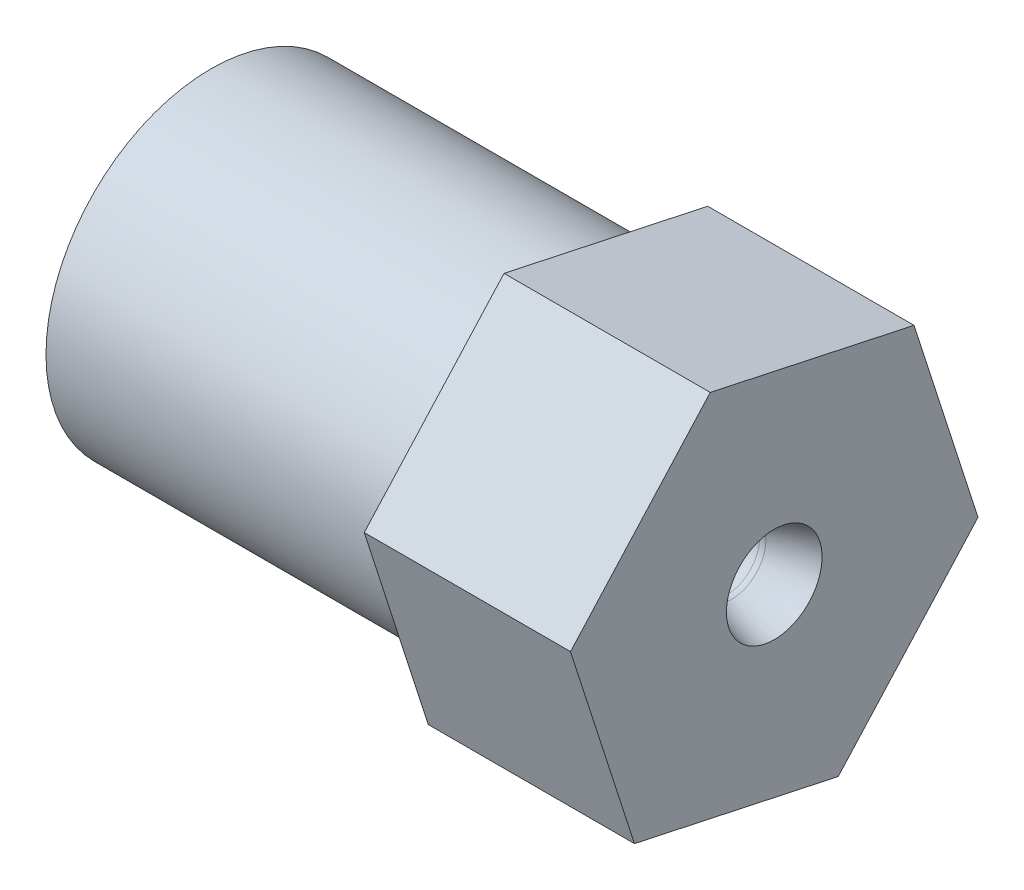
ISO-10303-21;
HEADER;
FILE_DESCRIPTION(('STEP AP214'),'2;1');
FILE_NAME('part.step','',(''),(''),'','','');
FILE_SCHEMA(('AUTOMOTIVE_DESIGN { 1 0 10303 214 1 1 1 1 }'));
ENDSEC;
DATA;
#1=APPLICATION_CONTEXT('core data for automotive mechanical design processes');
#2=APPLICATION_PROTOCOL_DEFINITION('international standard','automotive_design',2000,#1);
#3=PRODUCT_CONTEXT('',#1,'mechanical');
#4=PRODUCT('Part','Part','',(#3));
#5=PRODUCT_RELATED_PRODUCT_CATEGORY('part','',(#4));
#6=PRODUCT_DEFINITION_FORMATION('','',#4);
#7=PRODUCT_DEFINITION_CONTEXT('part definition',#1,'design');
#8=PRODUCT_DEFINITION('design','',#6,#7);
#9=PRODUCT_DEFINITION_SHAPE('','',#8);
#10=(LENGTH_UNIT() NAMED_UNIT(*) SI_UNIT(.MILLI.,.METRE.));
#11=(NAMED_UNIT(*) PLANE_ANGLE_UNIT() SI_UNIT($,.RADIAN.));
#12=(NAMED_UNIT(*) SI_UNIT($,.STERADIAN.) SOLID_ANGLE_UNIT());
#13=UNCERTAINTY_MEASURE_WITH_UNIT(LENGTH_MEASURE(1.E-05),#10,'distance_accuracy_value','');
#14=(GEOMETRIC_REPRESENTATION_CONTEXT(3) GLOBAL_UNCERTAINTY_ASSIGNED_CONTEXT((#13)) GLOBAL_UNIT_ASSIGNED_CONTEXT((#10,
#11,#12)) REPRESENTATION_CONTEXT('',''));
#15=CARTESIAN_POINT('',(0.,0.,0.));
#16=DIRECTION('',(0.,0.,1.));
#17=DIRECTION('',(1.,0.,0.));
#18=AXIS2_PLACEMENT_3D('',#15,#16,#17);
#19=CARTESIAN_POINT('',(0.,0.,0.));
#20=DIRECTION('',(-1.,0.,0.));
#21=DIRECTION('',(0.,0.,1.));
#22=AXIS2_PLACEMENT_3D('',#19,#20,#21);
#23=CYLINDRICAL_SURFACE('',#22,10.16);
#24=CARTESIAN_POINT('',(-10.4014737867327,0.,0.));
#25=DIRECTION('',(1.,0.,0.));
#26=DIRECTION('',(0.,0.,-1.));
#27=AXIS2_PLACEMENT_3D('',#24,#25,#26);
#28=CIRCLE('',#27,10.16);
#29=CARTESIAN_POINT('',(-10.4014737867327,0.,-10.16));
#30=VERTEX_POINT('',#29);
#31=EDGE_CURVE('E11',#30,#30,#28,.F.);
#32=ORIENTED_EDGE('',*,*,#31,.T.);
#33=EDGE_LOOP('',(#32));
#34=FACE_BOUND('',#33,.T.);
#35=CARTESIAN_POINT('',(-31.75,0.,0.));
#36=DIRECTION('',(-1.,0.,0.));
#37=DIRECTION('',(0.,0.,1.));
#38=AXIS2_PLACEMENT_3D('',#35,#36,#37);
#39=CIRCLE('',#38,10.16);
#40=CARTESIAN_POINT('',(-31.75,0.,10.16));
#41=VERTEX_POINT('',#40);
#42=EDGE_CURVE('E227',#41,#41,#39,.T.);
#43=ORIENTED_EDGE('',*,*,#42,.F.);
#44=EDGE_LOOP('',(#43));
#45=FACE_BOUND('',#44,.T.);
#46=ADVANCED_FACE('F39',(#34,#45),#23,.T.);
#47=CARTESIAN_POINT('',(0.,0.,0.));
#48=DIRECTION('',(-1.,0.,0.));
#49=DIRECTION('',(0.,0.,1.));
#50=AXIS2_PLACEMENT_3D('',#47,#48,#49);
#51=TOROIDAL_SURFACE('',#50,5.08,3.048);
#52=CARTESIAN_POINT('',(0.,0.,0.));
#53=DIRECTION('',(-1.,0.,0.));
#54=DIRECTION('',(0.,0.,1.));
#55=AXIS2_PLACEMENT_3D('',#52,#53,#54);
#56=CIRCLE('',#55,2.03200000000473);
#57=CARTESIAN_POINT('',(0.,0.,2.03200000000473));
#58=VERTEX_POINT('',#57);
#59=EDGE_CURVE('E179',#58,#58,#56,.T.);
#60=ORIENTED_EDGE('',*,*,#59,.F.);
#61=EDGE_LOOP('',(#60));
#62=FACE_BOUND('',#61,.T.);
#63=CARTESIAN_POINT('',(-2.15526146905657,0.,0.));
#64=DIRECTION('',(-1.,0.,0.));
#65=DIRECTION('',(0.,0.,1.));
#66=AXIS2_PLACEMENT_3D('',#63,#64,#65);
#67=CIRCLE('',#66,2.92473853094338);
#68=CARTESIAN_POINT('',(-2.15526146905657,0.,2.92473853094338));
#69=VERTEX_POINT('',#68);
#70=EDGE_CURVE('E144',#69,#69,#67,.T.);
#71=ORIENTED_EDGE('',*,*,#70,.T.);
#72=EDGE_LOOP('',(#71));
#73=FACE_BOUND('',#72,.T.);
#74=ADVANCED_FACE('F168',(#62,#73),#51,.T.);
#75=CARTESIAN_POINT('',(0.,0.,0.));
#76=DIRECTION('',(-1.,0.,0.));
#77=DIRECTION('',(0.,0.,1.));
#78=AXIS2_PLACEMENT_3D('',#75,#76,#77);
#79=TOROIDAL_SURFACE('',#78,2.8448,0.81279999999527);
#80=CARTESIAN_POINT('',(0.317586257187585,0.,0.));
#81=DIRECTION('',(-1.,0.,0.));
#82=DIRECTION('',(0.,0.,1.));
#83=AXIS2_PLACEMENT_3D('',#80,#81,#82);
#84=CIRCLE('',#83,2.09661365337699);
#85=CARTESIAN_POINT('',(0.317586257187585,0.,2.09661365337699));
#86=VERTEX_POINT('',#85);
#87=EDGE_CURVE('E233',#86,#86,#84,.T.);
#88=ORIENTED_EDGE('',*,*,#87,.F.);
#89=EDGE_LOOP('',(#88));
#90=FACE_BOUND('',#89,.T.);
#91=ORIENTED_EDGE('',*,*,#59,.T.);
#92=EDGE_LOOP('',(#91));
#93=FACE_BOUND('',#92,.T.);
#94=ADVANCED_FACE('F164',(#90,#93),#79,.T.);
#95=CARTESIAN_POINT('',(385600.415947016,-922680.749909568,0.));
#96=CARTESIAN_POINT('',(-390730.810905124,920506.950065199,0.));
#97=CARTESIAN_POINT('',(395862.476208277,-918324.76376621,0.));
#98=B_SPLINE_CURVE_WITH_KNOTS('',2,(#95,#96,#97),.UNSPECIFIED.,.F.,.F.,(3,3),(0.,1.),.UNSPECIFIED.);
#99=CARTESIAN_POINT('',(0.,0.,0.));
#100=DIRECTION('',(-1.,0.,0.));
#101=AXIS1_PLACEMENT('',#99,#100);
#102=SURFACE_OF_REVOLUTION('',#98,#101);
#103=CARTESIAN_POINT('',(2.93352621329061,0.,0.));
#104=DIRECTION('',(-1.,0.,0.));
#105=DIRECTION('',(0.,0.,1.));
#106=AXIS2_PLACEMENT_3D('',#103,#104,#105);
#107=CIRCLE('',#106,2.94464775482569);
#108=CARTESIAN_POINT('',(2.93352621329061,0.,2.94464775482569));
#109=VERTEX_POINT('',#108);
#110=EDGE_CURVE('E230',#109,#109,#107,.T.);
#111=ORIENTED_EDGE('',*,*,#110,.F.);
#112=EDGE_LOOP('',(#111));
#113=FACE_BOUND('',#112,.T.);
#114=ORIENTED_EDGE('',*,*,#87,.T.);
#115=EDGE_LOOP('',(#114));
#116=FACE_BOUND('',#115,.T.);
#117=ADVANCED_FACE('F159',(#113,#116),#102,.T.);
#118=CARTESIAN_POINT('',(2.93352621326732,10.16,0.));
#119=DIRECTION('',(-1.,0.,0.));
#120=DIRECTION('',(0.,0.,1.));
#121=AXIS2_PLACEMENT_3D('',#118,#119,#120);
#122=PLANE('',#121);
#123=ORIENTED_EDGE('',*,*,#110,.T.);
#124=EDGE_LOOP('',(#123));
#125=FACE_BOUND('',#124,.T.);
#126=DIRECTION('',(0.,-0.951681663898051,-0.307086324345838));
#127=VECTOR('',#126,1.);
#128=CARTESIAN_POINT('',(2.93352621326732,-3.41249677929311,10.575562490067));
#129=LINE('',#128,#127);
#130=CARTESIAN_POINT('',(2.93352621326732,2.69330707117879,12.5457684242006));
#131=VERTEX_POINT('',#130);
#132=CARTESIAN_POINT('',(2.93352621326732,-9.51830062976508,8.60535655593342));
#133=VERTEX_POINT('',#132);
#134=EDGE_CURVE('E127',#131,#133,#129,.T.);
#135=ORIENTED_EDGE('',*,*,#134,.T.);
#136=DIRECTION('',(0.,-0.209896273910743,-0.977723659424475));
#137=VECTOR('',#136,1.);
#138=CARTESIAN_POINT('',(2.93352621326732,-10.8649541653545,2.33247234383313));
#139=LINE('',#138,#137);
#140=CARTESIAN_POINT('',(2.93352621326732,-12.2116077009439,-3.94041186826731));
#141=VERTEX_POINT('',#140);
#142=EDGE_CURVE('E130',#133,#141,#139,.T.);
#143=ORIENTED_EDGE('',*,*,#142,.T.);
#144=DIRECTION('',(0.,0.741785389987309,-0.670637335078637));
#145=VECTOR('',#144,1.);
#146=CARTESIAN_POINT('',(2.93352621326732,-7.45245738606141,-8.24309014623402));
#147=LINE('',#146,#145);
#148=CARTESIAN_POINT('',(2.93352621326732,-2.69330707117886,-12.5457684242008));
#149=VERTEX_POINT('',#148);
#150=EDGE_CURVE('E133',#141,#149,#147,.T.);
#151=ORIENTED_EDGE('',*,*,#150,.T.);
#152=DIRECTION('',(0.,0.951681663898051,0.307086324345838));
#153=VECTOR('',#152,1.);
#154=CARTESIAN_POINT('',(2.93352621326732,3.41249677929314,-10.5755624900671));
#155=LINE('',#154,#153);
#156=CARTESIAN_POINT('',(2.93352621326732,9.51830062976503,-8.60535655593354));
#157=VERTEX_POINT('',#156);
#158=EDGE_CURVE('E136',#149,#157,#155,.T.);
#159=ORIENTED_EDGE('',*,*,#158,.T.);
#160=DIRECTION('',(0.,0.209896273910741,0.977723659424475));
#161=VECTOR('',#160,1.);
#162=CARTESIAN_POINT('',(2.93352621326732,10.8649541653544,-2.3324723438331));
#163=LINE('',#162,#161);
#164=CARTESIAN_POINT('',(2.93352621326732,12.2116077009438,3.94041186826717));
#165=VERTEX_POINT('',#164);
#166=EDGE_CURVE('E104',#157,#165,#163,.T.);
#167=ORIENTED_EDGE('',*,*,#166,.T.);
#168=DIRECTION('',(0.,-0.741785389987308,0.670637335078638));
#169=VECTOR('',#168,1.);
#170=CARTESIAN_POINT('',(2.93352621326732,7.45245738606132,8.2430901462339));
#171=LINE('',#170,#169);
#172=EDGE_CURVE('E139',#165,#131,#171,.T.);
#173=ORIENTED_EDGE('',*,*,#172,.T.);
#174=EDGE_LOOP('',(#135,#143,#151,#159,#167,#173));
#175=FACE_BOUND('',#174,.T.);
#176=ADVANCED_FACE('F163',(#125,#175),#122,.F.);
#177=CARTESIAN_POINT('',(-31.75,10.16,0.));
#178=DIRECTION('',(1.,0.,0.));
#179=DIRECTION('',(0.,0.,-1.));
#180=AXIS2_PLACEMENT_3D('',#177,#178,#179);
#181=PLANE('',#180);
#182=CARTESIAN_POINT('',(-31.75,0.,0.));
#183=DIRECTION('',(-1.,0.,0.));
#184=DIRECTION('',(0.,0.,1.));
#185=AXIS2_PLACEMENT_3D('',#182,#183,#184);
#186=CIRCLE('',#185,8.6614);
#187=CARTESIAN_POINT('',(-31.75,0.,8.6614));
#188=VERTEX_POINT('',#187);
#189=EDGE_CURVE('E224',#188,#188,#186,.T.);
#190=ORIENTED_EDGE('',*,*,#189,.F.);
#191=EDGE_LOOP('',(#190));
#192=FACE_BOUND('',#191,.T.);
#193=ORIENTED_EDGE('',*,*,#42,.T.);
#194=EDGE_LOOP('',(#193));
#195=FACE_BOUND('',#194,.T.);
#196=ADVANCED_FACE('F251',(#192,#195),#181,.F.);
#197=CARTESIAN_POINT('',(-31.115,0.,0.));
#198=DIRECTION('',(-1.,0.,0.));
#199=DIRECTION('',(0.,0.,1.));
#200=AXIS2_PLACEMENT_3D('',#197,#198,#199);
#201=TOROIDAL_SURFACE('',#200,8.6614,0.635);
#202=CARTESIAN_POINT('',(-31.115,0.,0.));
#203=DIRECTION('',(-1.,0.,0.));
#204=DIRECTION('',(0.,0.,1.));
#205=AXIS2_PLACEMENT_3D('',#202,#203,#204);
#206=CIRCLE('',#205,8.02639999999999);
#207=CARTESIAN_POINT('',(-31.115,0.,8.02639999999999));
#208=VERTEX_POINT('',#207);
#209=EDGE_CURVE('E221',#208,#208,#206,.T.);
#210=ORIENTED_EDGE('',*,*,#209,.F.);
#211=EDGE_LOOP('',(#210));
#212=FACE_BOUND('',#211,.T.);
#213=ORIENTED_EDGE('',*,*,#189,.T.);
#214=EDGE_LOOP('',(#213));
#215=FACE_BOUND('',#214,.T.);
#216=ADVANCED_FACE('F253',(#212,#215),#201,.T.);
#217=CARTESIAN_POINT('',(0.,0.,0.));
#218=DIRECTION('',(-1.,0.,0.));
#219=DIRECTION('',(0.,0.,1.));
#220=AXIS2_PLACEMENT_3D('',#217,#218,#219);
#221=CYLINDRICAL_SURFACE('',#220,8.02639999999999);
#222=CARTESIAN_POINT('',(-25.019,0.,0.));
#223=DIRECTION('',(-1.,0.,0.));
#224=DIRECTION('',(0.,0.,1.));
#225=AXIS2_PLACEMENT_3D('',#222,#223,#224);
#226=CIRCLE('',#225,8.02639999999999);
#227=CARTESIAN_POINT('',(-25.019,0.,8.02639999999999));
#228=VERTEX_POINT('',#227);
#229=EDGE_CURVE('E218',#228,#228,#226,.T.);
#230=ORIENTED_EDGE('',*,*,#229,.F.);
#231=EDGE_LOOP('',(#230));
#232=FACE_BOUND('',#231,.T.);
#233=ORIENTED_EDGE('',*,*,#209,.T.);
#234=EDGE_LOOP('',(#233));
#235=FACE_BOUND('',#234,.T.);
#236=ADVANCED_FACE('F260',(#232,#235),#221,.F.);
#237=CARTESIAN_POINT('',(-25.019,0.,0.));
#238=DIRECTION('',(-1.,0.,0.));
#239=DIRECTION('',(0.,0.,1.));
#240=AXIS2_PLACEMENT_3D('',#237,#238,#239);
#241=TOROIDAL_SURFACE('',#240,7.89939999999999,0.127);
#242=CARTESIAN_POINT('',(-24.892,0.,0.));
#243=DIRECTION('',(-1.,0.,0.));
#244=DIRECTION('',(0.,0.,1.));
#245=AXIS2_PLACEMENT_3D('',#242,#243,#244);
#246=CIRCLE('',#245,7.89939999999999);
#247=CARTESIAN_POINT('',(-24.892,0.,7.89939999999999));
#248=VERTEX_POINT('',#247);
#249=EDGE_CURVE('E215',#248,#248,#246,.T.);
#250=ORIENTED_EDGE('',*,*,#249,.F.);
#251=EDGE_LOOP('',(#250));
#252=FACE_BOUND('',#251,.T.);
#253=ORIENTED_EDGE('',*,*,#229,.T.);
#254=EDGE_LOOP('',(#253));
#255=FACE_BOUND('',#254,.T.);
#256=ADVANCED_FACE('F268',(#252,#255),#241,.F.);
#257=CARTESIAN_POINT('',(-24.892,6.9469,0.));
#258=DIRECTION('',(1.,0.,0.));
#259=DIRECTION('',(0.,0.,-1.));
#260=AXIS2_PLACEMENT_3D('',#257,#258,#259);
#261=PLANE('',#260);
#262=CARTESIAN_POINT('',(-24.892,0.,0.));
#263=DIRECTION('',(-1.,0.,0.));
#264=DIRECTION('',(0.,0.,1.));
#265=AXIS2_PLACEMENT_3D('',#262,#263,#264);
#266=CIRCLE('',#265,6.9469);
#267=CARTESIAN_POINT('',(-24.892,0.,6.9469));
#268=VERTEX_POINT('',#267);
#269=EDGE_CURVE('E212',#268,#268,#266,.T.);
#270=ORIENTED_EDGE('',*,*,#269,.F.);
#271=EDGE_LOOP('',(#270));
#272=FACE_BOUND('',#271,.T.);
#273=ORIENTED_EDGE('',*,*,#249,.T.);
#274=EDGE_LOOP('',(#273));
#275=FACE_BOUND('',#274,.T.);
#276=ADVANCED_FACE('F272',(#272,#275),#261,.F.);
#277=CARTESIAN_POINT('',(0.,0.,0.));
#278=DIRECTION('',(-1.,0.,0.));
#279=DIRECTION('',(0.,0.,1.));
#280=AXIS2_PLACEMENT_3D('',#277,#278,#279);
#281=CYLINDRICAL_SURFACE('',#280,6.9469);
#282=CARTESIAN_POINT('',(-20.066,0.,0.));
#283=DIRECTION('',(-1.,0.,0.));
#284=DIRECTION('',(0.,0.,1.));
#285=AXIS2_PLACEMENT_3D('',#282,#283,#284);
#286=CIRCLE('',#285,6.9469);
#287=CARTESIAN_POINT('',(-20.066,0.,6.9469));
#288=VERTEX_POINT('',#287);
#289=EDGE_CURVE('E209',#288,#288,#286,.T.);
#290=ORIENTED_EDGE('',*,*,#289,.F.);
#291=EDGE_LOOP('',(#290));
#292=FACE_BOUND('',#291,.T.);
#293=ORIENTED_EDGE('',*,*,#269,.T.);
#294=EDGE_LOOP('',(#293));
#295=FACE_BOUND('',#294,.T.);
#296=ADVANCED_FACE('F276',(#292,#295),#281,.F.);
#297=CARTESIAN_POINT('',(-20.066,0.,0.));
#298=DIRECTION('',(-1.,0.,0.));
#299=DIRECTION('',(0.,0.,1.));
#300=AXIS2_PLACEMENT_3D('',#297,#298,#299);
#301=TOROIDAL_SURFACE('',#300,6.8199,0.127);
#302=CARTESIAN_POINT('',(-19.939,0.,0.));
#303=DIRECTION('',(-1.,0.,0.));
#304=DIRECTION('',(0.,0.,1.));
#305=AXIS2_PLACEMENT_3D('',#302,#303,#304);
#306=CIRCLE('',#305,6.8199);
#307=CARTESIAN_POINT('',(-19.939,0.,6.8199));
#308=VERTEX_POINT('',#307);
#309=EDGE_CURVE('E206',#308,#308,#306,.T.);
#310=ORIENTED_EDGE('',*,*,#309,.F.);
#311=EDGE_LOOP('',(#310));
#312=FACE_BOUND('',#311,.T.);
#313=ORIENTED_EDGE('',*,*,#289,.T.);
#314=EDGE_LOOP('',(#313));
#315=FACE_BOUND('',#314,.T.);
#316=ADVANCED_FACE('F280',(#312,#315),#301,.F.);
#317=CARTESIAN_POINT('',(-19.939,5.46100000000001,0.));
#318=DIRECTION('',(1.,0.,0.));
#319=DIRECTION('',(0.,0.,-1.));
#320=AXIS2_PLACEMENT_3D('',#317,#318,#319);
#321=PLANE('',#320);
#322=CARTESIAN_POINT('',(-19.939,0.,0.));
#323=DIRECTION('',(-1.,0.,0.));
#324=DIRECTION('',(0.,0.,1.));
#325=AXIS2_PLACEMENT_3D('',#322,#323,#324);
#326=CIRCLE('',#325,5.46100000000001);
#327=CARTESIAN_POINT('',(-19.939,0.,5.46100000000001));
#328=VERTEX_POINT('',#327);
#329=EDGE_CURVE('E203',#328,#328,#326,.T.);
#330=ORIENTED_EDGE('',*,*,#329,.F.);
#331=EDGE_LOOP('',(#330));
#332=FACE_BOUND('',#331,.T.);
#333=ORIENTED_EDGE('',*,*,#309,.T.);
#334=EDGE_LOOP('',(#333));
#335=FACE_BOUND('',#334,.T.);
#336=ADVANCED_FACE('F284',(#332,#335),#321,.F.);
#337=CARTESIAN_POINT('',(-19.304,0.,0.));
#338=DIRECTION('',(-1.,0.,0.));
#339=DIRECTION('',(0.,0.,1.));
#340=AXIS2_PLACEMENT_3D('',#337,#338,#339);
#341=TOROIDAL_SURFACE('',#340,5.461,0.635);
#342=CARTESIAN_POINT('',(-19.304,0.,0.));
#343=DIRECTION('',(-1.,0.,0.));
#344=DIRECTION('',(0.,0.,1.));
#345=AXIS2_PLACEMENT_3D('',#342,#343,#344);
#346=CIRCLE('',#345,4.826);
#347=CARTESIAN_POINT('',(-19.304,0.,4.826));
#348=VERTEX_POINT('',#347);
#349=EDGE_CURVE('E200',#348,#348,#346,.T.);
#350=ORIENTED_EDGE('',*,*,#349,.F.);
#351=EDGE_LOOP('',(#350));
#352=FACE_BOUND('',#351,.T.);
#353=ORIENTED_EDGE('',*,*,#329,.T.);
#354=EDGE_LOOP('',(#353));
#355=FACE_BOUND('',#354,.T.);
#356=ADVANCED_FACE('F288',(#352,#355),#341,.T.);
#357=CARTESIAN_POINT('',(0.,0.,0.));
#358=DIRECTION('',(-1.,0.,0.));
#359=DIRECTION('',(0.,0.,1.));
#360=AXIS2_PLACEMENT_3D('',#357,#358,#359);
#361=CYLINDRICAL_SURFACE('',#360,4.826);
#362=CARTESIAN_POINT('',(-13.589,0.,0.));
#363=DIRECTION('',(-1.,0.,0.));
#364=DIRECTION('',(0.,0.,1.));
#365=AXIS2_PLACEMENT_3D('',#362,#363,#364);
#366=CIRCLE('',#365,4.826);
#367=CARTESIAN_POINT('',(-13.589,0.,4.826));
#368=VERTEX_POINT('',#367);
#369=EDGE_CURVE('E197',#368,#368,#366,.T.);
#370=ORIENTED_EDGE('',*,*,#369,.F.);
#371=EDGE_LOOP('',(#370));
#372=FACE_BOUND('',#371,.T.);
#373=ORIENTED_EDGE('',*,*,#349,.T.);
#374=EDGE_LOOP('',(#373));
#375=FACE_BOUND('',#374,.T.);
#376=ADVANCED_FACE('F292',(#372,#375),#361,.F.);
#377=CARTESIAN_POINT('',(-13.589,0.,0.));
#378=DIRECTION('',(-1.,0.,0.));
#379=DIRECTION('',(0.,0.,1.));
#380=AXIS2_PLACEMENT_3D('',#377,#378,#379);
#381=TOROIDAL_SURFACE('',#380,4.699,0.127);
#382=CARTESIAN_POINT('',(-13.462,0.,0.));
#383=DIRECTION('',(-1.,0.,0.));
#384=DIRECTION('',(0.,0.,1.));
#385=AXIS2_PLACEMENT_3D('',#382,#383,#384);
#386=CIRCLE('',#385,4.699);
#387=CARTESIAN_POINT('',(-13.462,0.,4.699));
#388=VERTEX_POINT('',#387);
#389=EDGE_CURVE('E194',#388,#388,#386,.T.);
#390=ORIENTED_EDGE('',*,*,#389,.F.);
#391=EDGE_LOOP('',(#390));
#392=FACE_BOUND('',#391,.T.);
#393=ORIENTED_EDGE('',*,*,#369,.T.);
#394=EDGE_LOOP('',(#393));
#395=FACE_BOUND('',#394,.T.);
#396=ADVANCED_FACE('F296',(#392,#395),#381,.F.);
#397=CARTESIAN_POINT('',(-13.462,4.445,0.));
#398=DIRECTION('',(1.,0.,0.));
#399=DIRECTION('',(0.,0.,-1.));
#400=AXIS2_PLACEMENT_3D('',#397,#398,#399);
#401=PLANE('',#400);
#402=CARTESIAN_POINT('',(-13.462,0.,0.));
#403=DIRECTION('',(-1.,0.,0.));
#404=DIRECTION('',(0.,0.,1.));
#405=AXIS2_PLACEMENT_3D('',#402,#403,#404);
#406=CIRCLE('',#405,4.445);
#407=CARTESIAN_POINT('',(-13.462,0.,4.445));
#408=VERTEX_POINT('',#407);
#409=EDGE_CURVE('E189',#408,#408,#406,.T.);
#410=ORIENTED_EDGE('',*,*,#409,.F.);
#411=EDGE_LOOP('',(#410));
#412=FACE_BOUND('',#411,.T.);
#413=ORIENTED_EDGE('',*,*,#389,.T.);
#414=EDGE_LOOP('',(#413));
#415=FACE_BOUND('',#414,.T.);
#416=ADVANCED_FACE('F300',(#412,#415),#401,.F.);
#417=CARTESIAN_POINT('',(0.,0.,0.));
#418=DIRECTION('',(-1.,0.,0.));
#419=DIRECTION('',(0.,0.,1.));
#420=AXIS2_PLACEMENT_3D('',#417,#418,#419);
#421=CYLINDRICAL_SURFACE('',#420,4.445);
#422=CARTESIAN_POINT('',(-4.99065099864778,0.,0.));
#423=DIRECTION('',(-1.,0.,0.));
#424=DIRECTION('',(0.,0.,1.));
#425=AXIS2_PLACEMENT_3D('',#422,#423,#424);
#426=CIRCLE('',#425,4.445);
#427=CARTESIAN_POINT('',(-4.99065099864778,0.,4.445));
#428=VERTEX_POINT('',#427);
#429=EDGE_CURVE('E185',#428,#428,#426,.T.);
#430=ORIENTED_EDGE('',*,*,#429,.F.);
#431=EDGE_LOOP('',(#430));
#432=FACE_BOUND('',#431,.T.);
#433=ORIENTED_EDGE('',*,*,#409,.T.);
#434=EDGE_LOOP('',(#433));
#435=FACE_BOUND('',#434,.T.);
#436=ADVANCED_FACE('F304',(#432,#435),#421,.F.);
#437=CARTESIAN_POINT('',(-4.99065099864778,0.,0.));
#438=DIRECTION('',(-1.,0.,0.));
#439=DIRECTION('',(0.,0.,1.));
#440=AXIS2_PLACEMENT_3D('',#437,#438,#439);
#441=DEGENERATE_TOROIDAL_SURFACE('',#440,1.27,3.175,.T.);
#442=CARTESIAN_POINT('',(-2.74558696838052,0.,0.));
#443=DIRECTION('',(-1.,0.,0.));
#444=DIRECTION('',(0.,0.,1.));
#445=AXIS2_PLACEMENT_3D('',#442,#443,#444);
#446=CIRCLE('',#445,3.51506403026731);
#447=CARTESIAN_POINT('',(-2.74558696838052,0.,3.51506403026731));
#448=VERTEX_POINT('',#447);
#449=EDGE_CURVE('E183',#448,#448,#446,.T.);
#450=ORIENTED_EDGE('',*,*,#449,.F.);
#451=EDGE_LOOP('',(#450));
#452=FACE_BOUND('',#451,.T.);
#453=ORIENTED_EDGE('',*,*,#429,.T.);
#454=EDGE_LOOP('',(#453));
#455=FACE_BOUND('',#454,.T.);
#456=ADVANCED_FACE('F308',(#452,#455),#441,.F.);
#457=CARTESIAN_POINT('',(-2.74558696838052,0.,0.));
#458=DIRECTION('',(-1.,0.,0.));
#459=DIRECTION('',(0.,0.,1.));
#460=AXIS2_PLACEMENT_3D('',#457,#458,#459);
#461=CONICAL_SURFACE('',#460,3.51506403026731,0.785398163397435);
#462=ORIENTED_EDGE('',*,*,#70,.F.);
#463=EDGE_LOOP('',(#462));
#464=FACE_BOUND('',#463,.T.);
#465=ORIENTED_EDGE('',*,*,#449,.T.);
#466=EDGE_LOOP('',(#465));
#467=FACE_BOUND('',#466,.T.);
#468=ADVANCED_FACE('F312',(#464,#467),#461,.F.);
#469=CARTESIAN_POINT('',(-9.76647378673268,-3.41249677929311,10.575562490067));
#470=DIRECTION('',(0.,-0.307086324345838,0.951681663898051));
#471=DIRECTION('',(0.,-0.951681663898051,-0.307086324345838));
#472=AXIS2_PLACEMENT_3D('',#469,#470,#471);
#473=PLANE('',#472);
#474=ORIENTED_EDGE('',*,*,#134,.F.);
#475=DIRECTION('',(1.,0.,0.));
#476=VECTOR('',#475,1.);
#477=CARTESIAN_POINT('',(-9.76647378673268,2.69330707117879,12.5457684242006));
#478=LINE('',#477,#476);
#479=CARTESIAN_POINT('',(-9.76647378673268,2.69330707117879,12.5457684242006));
#480=VERTEX_POINT('',#479);
#481=EDGE_CURVE('E56',#480,#131,#478,.T.);
#482=ORIENTED_EDGE('',*,*,#481,.F.);
#483=DIRECTION('',(0.,-0.951681663898051,-0.307086324345838));
#484=VECTOR('',#483,1.);
#485=CARTESIAN_POINT('',(-9.76647378673268,-3.41249677929311,10.575562490067));
#486=LINE('',#485,#484);
#487=CARTESIAN_POINT('',(-9.76647378673268,-9.51830062976508,8.60535655593342));
#488=VERTEX_POINT('',#487);
#489=EDGE_CURVE('E142',#480,#488,#486,.T.);
#490=ORIENTED_EDGE('',*,*,#489,.T.);
#491=DIRECTION('',(1.,0.,0.));
#492=VECTOR('',#491,1.);
#493=CARTESIAN_POINT('',(-9.76647378673268,-9.51830062976508,8.60535655593342));
#494=LINE('',#493,#492);
#495=EDGE_CURVE('E91',#488,#133,#494,.T.);
#496=ORIENTED_EDGE('',*,*,#495,.T.);
#497=EDGE_LOOP('',(#474,#482,#490,#496));
#498=FACE_BOUND('',#497,.T.);
#499=ADVANCED_FACE('F316',(#498),#473,.T.);
#500=CARTESIAN_POINT('',(-9.76647378673268,7.45245738606132,8.2430901462339));
#501=DIRECTION('',(0.,0.670637335078638,0.741785389987308));
#502=DIRECTION('',(0.,-0.741785389987308,0.670637335078638));
#503=AXIS2_PLACEMENT_3D('',#500,#501,#502);
#504=PLANE('',#503);
#505=ORIENTED_EDGE('',*,*,#172,.F.);
#506=DIRECTION('',(1.,0.,0.));
#507=VECTOR('',#506,1.);
#508=CARTESIAN_POINT('',(-9.76647378673268,12.2116077009438,3.94041186826717));
#509=LINE('',#508,#507);
#510=CARTESIAN_POINT('',(-9.76647378673268,12.2116077009438,3.94041186826717));
#511=VERTEX_POINT('',#510);
#512=EDGE_CURVE('E79',#511,#165,#509,.T.);
#513=ORIENTED_EDGE('',*,*,#512,.F.);
#514=DIRECTION('',(0.,-0.741785389987308,0.670637335078638));
#515=VECTOR('',#514,1.);
#516=CARTESIAN_POINT('',(-9.76647378673268,7.45245738606132,8.2430901462339));
#517=LINE('',#516,#515);
#518=EDGE_CURVE('E117',#511,#480,#517,.T.);
#519=ORIENTED_EDGE('',*,*,#518,.T.);
#520=ORIENTED_EDGE('',*,*,#481,.T.);
#521=EDGE_LOOP('',(#505,#513,#519,#520));
#522=FACE_BOUND('',#521,.T.);
#523=ADVANCED_FACE('F319',(#522),#504,.T.);
#524=CARTESIAN_POINT('',(-9.76647378673268,10.8649541653544,-2.3324723438331));
#525=DIRECTION('',(0.,0.977723659424475,-0.209896273910741));
#526=DIRECTION('',(0.,0.209896273910741,0.977723659424475));
#527=AXIS2_PLACEMENT_3D('',#524,#525,#526);
#528=PLANE('',#527);
#529=ORIENTED_EDGE('',*,*,#166,.F.);
#530=DIRECTION('',(1.,0.,0.));
#531=VECTOR('',#530,1.);
#532=CARTESIAN_POINT('',(-9.76647378673268,9.51830062976503,-8.60535655593354));
#533=LINE('',#532,#531);
#534=CARTESIAN_POINT('',(-9.76647378673268,9.51830062976503,-8.60535655593354));
#535=VERTEX_POINT('',#534);
#536=EDGE_CURVE('E99',#535,#157,#533,.T.);
#537=ORIENTED_EDGE('',*,*,#536,.F.);
#538=DIRECTION('',(0.,0.209896273910741,0.977723659424475));
#539=VECTOR('',#538,1.);
#540=CARTESIAN_POINT('',(-9.76647378673268,10.8649541653544,-2.3324723438331));
#541=LINE('',#540,#539);
#542=EDGE_CURVE('E102',#535,#511,#541,.T.);
#543=ORIENTED_EDGE('',*,*,#542,.T.);
#544=ORIENTED_EDGE('',*,*,#512,.T.);
#545=EDGE_LOOP('',(#529,#537,#543,#544));
#546=FACE_BOUND('',#545,.T.);
#547=ADVANCED_FACE('F101',(#546),#528,.T.);
#548=CARTESIAN_POINT('',(-9.76647378673268,3.41249677929314,-10.5755624900671));
#549=DIRECTION('',(0.,0.307086324345838,-0.951681663898051));
#550=DIRECTION('',(0.,0.951681663898051,0.307086324345838));
#551=AXIS2_PLACEMENT_3D('',#548,#549,#550);
#552=PLANE('',#551);
#553=ORIENTED_EDGE('',*,*,#158,.F.);
#554=DIRECTION('',(1.,0.,0.));
#555=VECTOR('',#554,1.);
#556=CARTESIAN_POINT('',(-9.76647378673268,-2.69330707117886,-12.5457684242008));
#557=LINE('',#556,#555);
#558=CARTESIAN_POINT('',(-9.76647378673268,-2.69330707117886,-12.5457684242008));
#559=VERTEX_POINT('',#558);
#560=EDGE_CURVE('E109',#559,#149,#557,.T.);
#561=ORIENTED_EDGE('',*,*,#560,.F.);
#562=DIRECTION('',(0.,0.951681663898051,0.307086324345838));
#563=VECTOR('',#562,1.);
#564=CARTESIAN_POINT('',(-9.76647378673268,3.41249677929314,-10.5755624900671));
#565=LINE('',#564,#563);
#566=EDGE_CURVE('E115',#559,#535,#565,.T.);
#567=ORIENTED_EDGE('',*,*,#566,.T.);
#568=ORIENTED_EDGE('',*,*,#536,.T.);
#569=EDGE_LOOP('',(#553,#561,#567,#568));
#570=FACE_BOUND('',#569,.T.);
#571=ADVANCED_FACE('F119',(#570),#552,.T.);
#572=CARTESIAN_POINT('',(-9.76647378673268,-7.45245738606141,-8.24309014623402));
#573=DIRECTION('',(0.,-0.670637335078637,-0.741785389987309));
#574=DIRECTION('',(0.,0.741785389987309,-0.670637335078637));
#575=AXIS2_PLACEMENT_3D('',#572,#573,#574);
#576=PLANE('',#575);
#577=ORIENTED_EDGE('',*,*,#150,.F.);
#578=DIRECTION('',(1.,0.,0.));
#579=VECTOR('',#578,1.);
#580=CARTESIAN_POINT('',(-9.76647378673268,-12.2116077009439,-3.94041186826731));
#581=LINE('',#580,#579);
#582=CARTESIAN_POINT('',(-9.76647378673268,-12.2116077009439,-3.94041186826731));
#583=VERTEX_POINT('',#582);
#584=EDGE_CURVE('E147',#583,#141,#581,.T.);
#585=ORIENTED_EDGE('',*,*,#584,.F.);
#586=DIRECTION('',(0.,0.741785389987309,-0.670637335078637));
#587=VECTOR('',#586,1.);
#588=CARTESIAN_POINT('',(-9.76647378673268,-7.45245738606141,-8.24309014623402));
#589=LINE('',#588,#587);
#590=EDGE_CURVE('E120',#583,#559,#589,.T.);
#591=ORIENTED_EDGE('',*,*,#590,.T.);
#592=ORIENTED_EDGE('',*,*,#560,.T.);
#593=EDGE_LOOP('',(#577,#585,#591,#592));
#594=FACE_BOUND('',#593,.T.);
#595=ADVANCED_FACE('F322',(#594),#576,.T.);
#596=CARTESIAN_POINT('',(-9.76647378673268,-10.8649541653545,2.33247234383313));
#597=DIRECTION('',(0.,-0.977723659424475,0.209896273910743));
#598=DIRECTION('',(0.,-0.209896273910743,-0.977723659424475));
#599=AXIS2_PLACEMENT_3D('',#596,#597,#598);
#600=PLANE('',#599);
#601=ORIENTED_EDGE('',*,*,#142,.F.);
#602=ORIENTED_EDGE('',*,*,#495,.F.);
#603=DIRECTION('',(0.,-0.209896273910743,-0.977723659424475));
#604=VECTOR('',#603,1.);
#605=CARTESIAN_POINT('',(-9.76647378673268,-10.8649541653545,2.33247234383313));
#606=LINE('',#605,#604);
#607=EDGE_CURVE('E122',#488,#583,#606,.T.);
#608=ORIENTED_EDGE('',*,*,#607,.T.);
#609=ORIENTED_EDGE('',*,*,#584,.T.);
#610=EDGE_LOOP('',(#601,#602,#608,#609));
#611=FACE_BOUND('',#610,.T.);
#612=ADVANCED_FACE('F245',(#611),#600,.T.);
#613=CARTESIAN_POINT('',(-9.76647378673268,0.,0.));
#614=DIRECTION('',(1.,0.,0.));
#615=DIRECTION('',(0.,0.,-1.));
#616=AXIS2_PLACEMENT_3D('',#613,#614,#615);
#617=PLANE('',#616);
#618=CARTESIAN_POINT('',(-9.76647378673268,0.,0.));
#619=DIRECTION('',(1.,0.,0.));
#620=DIRECTION('',(0.,0.,-1.));
#621=AXIS2_PLACEMENT_3D('',#618,#619,#620);
#622=CIRCLE('',#621,10.795);
#623=CARTESIAN_POINT('',(-9.76647378673268,0.,-10.795));
#624=VERTEX_POINT('',#623);
#625=EDGE_CURVE('E48',#624,#624,#622,.T.);
#626=ORIENTED_EDGE('',*,*,#625,.T.);
#627=EDGE_LOOP('',(#626));
#628=FACE_BOUND('',#627,.T.);
#629=ORIENTED_EDGE('',*,*,#489,.F.);
#630=ORIENTED_EDGE('',*,*,#518,.F.);
#631=ORIENTED_EDGE('',*,*,#542,.F.);
#632=ORIENTED_EDGE('',*,*,#566,.F.);
#633=ORIENTED_EDGE('',*,*,#590,.F.);
#634=ORIENTED_EDGE('',*,*,#607,.F.);
#635=EDGE_LOOP('',(#629,#630,#631,#632,#633,#634));
#636=FACE_BOUND('',#635,.T.);
#637=ADVANCED_FACE('F113',(#628,#636),#617,.F.);
#638=CARTESIAN_POINT('',(-10.4014737867327,0.,0.));
#639=DIRECTION('',(1.,0.,0.));
#640=DIRECTION('',(0.,0.,-1.));
#641=AXIS2_PLACEMENT_3D('',#638,#639,#640);
#642=TOROIDAL_SURFACE('',#641,10.795,0.635);
#643=ORIENTED_EDGE('',*,*,#31,.F.);
#644=EDGE_LOOP('',(#643));
#645=FACE_BOUND('',#644,.T.);
#646=ORIENTED_EDGE('',*,*,#625,.F.);
#647=EDGE_LOOP('',(#646));
#648=FACE_BOUND('',#647,.T.);
#649=ADVANCED_FACE('F41',(#645,#648),#642,.F.);
#650=CLOSED_SHELL('',(#46,#74,#94,#117,#176,#196,#216,#236,#256,#276,#296,#316,#336,#356,#376,
#396,#416,#436,#456,#468,#499,#523,#547,#571,#595,#612,#637,#649));
#651=MANIFOLD_SOLID_BREP('B2',#650);
#652=ADVANCED_BREP_SHAPE_REPRESENTATION('',(#18,#651),#14);
#653=SHAPE_DEFINITION_REPRESENTATION(#9,#652);
ENDSEC;
END-ISO-10303-21;
